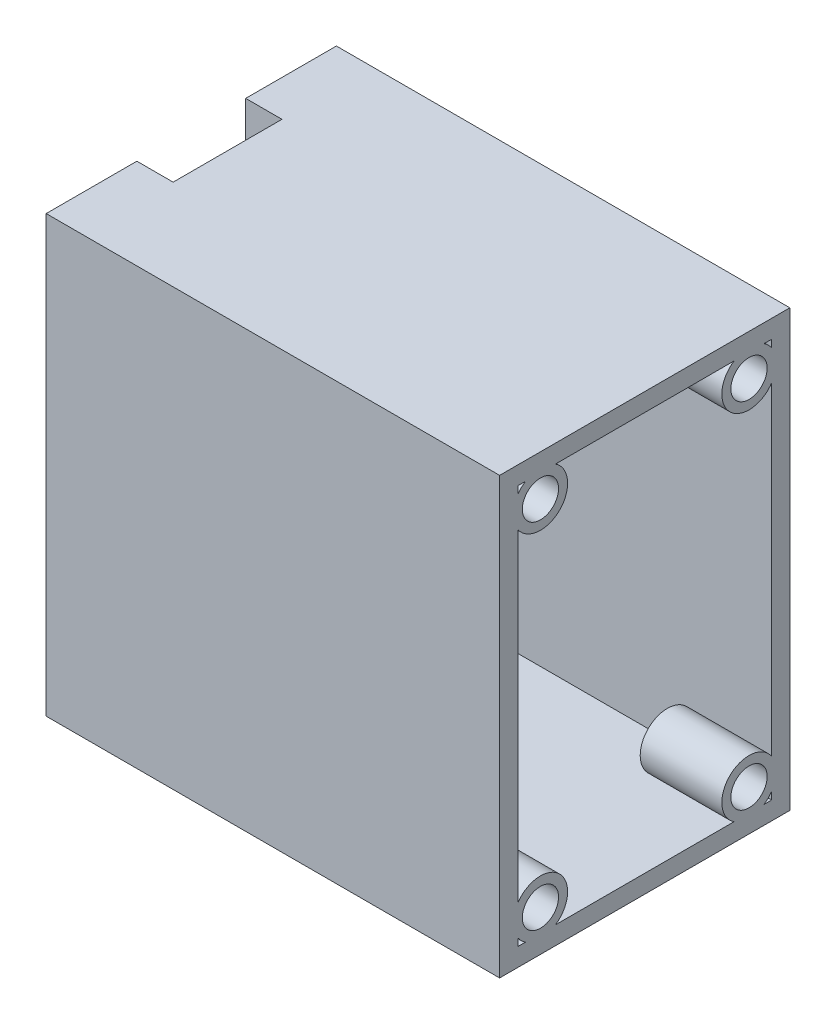
ISO-10303-21;
HEADER;
FILE_DESCRIPTION(('STEP AP214'),'2;1');
FILE_NAME('part.step','',(''),(''),'','','');
FILE_SCHEMA(('AUTOMOTIVE_DESIGN { 1 0 10303 214 1 1 1 1 }'));
ENDSEC;
DATA;
#1=APPLICATION_CONTEXT('core data for automotive mechanical design processes');
#2=APPLICATION_PROTOCOL_DEFINITION('international standard','automotive_design',2000,#1);
#3=PRODUCT_CONTEXT('',#1,'mechanical');
#4=PRODUCT('Part','Part','',(#3));
#5=PRODUCT_RELATED_PRODUCT_CATEGORY('part','',(#4));
#6=PRODUCT_DEFINITION_FORMATION('','',#4);
#7=PRODUCT_DEFINITION_CONTEXT('part definition',#1,'design');
#8=PRODUCT_DEFINITION('design','',#6,#7);
#9=PRODUCT_DEFINITION_SHAPE('','',#8);
#10=(LENGTH_UNIT() NAMED_UNIT(*) SI_UNIT(.MILLI.,.METRE.));
#11=(NAMED_UNIT(*) PLANE_ANGLE_UNIT() SI_UNIT($,.RADIAN.));
#12=(NAMED_UNIT(*) SI_UNIT($,.STERADIAN.) SOLID_ANGLE_UNIT());
#13=UNCERTAINTY_MEASURE_WITH_UNIT(LENGTH_MEASURE(1.E-05),#10,'distance_accuracy_value','');
#14=(GEOMETRIC_REPRESENTATION_CONTEXT(3) GLOBAL_UNCERTAINTY_ASSIGNED_CONTEXT((#13)) GLOBAL_UNIT_ASSIGNED_CONTEXT((#10,
#11,#12)) REPRESENTATION_CONTEXT('',''));
#15=CARTESIAN_POINT('',(0.,0.,0.));
#16=DIRECTION('',(0.,0.,1.));
#17=DIRECTION('',(1.,0.,0.));
#18=AXIS2_PLACEMENT_3D('',#15,#16,#17);
#19=CARTESIAN_POINT('',(-24.,0.,16.));
#20=DIRECTION('',(0.,0.,1.));
#21=DIRECTION('',(1.,0.,0.));
#22=AXIS2_PLACEMENT_3D('',#19,#20,#21);
#23=PLANE('',#22);
#24=DIRECTION('',(0.,-1.,0.));
#25=VECTOR('',#24,1.);
#26=CARTESIAN_POINT('',(25.,-23.,16.));
#27=LINE('',#26,#25);
#28=CARTESIAN_POINT('',(25.,24.,16.));
#29=VERTEX_POINT('',#28);
#30=CARTESIAN_POINT('',(25.,-24.,16.));
#31=VERTEX_POINT('',#30);
#32=EDGE_CURVE('E438',#29,#31,#27,.T.);
#33=ORIENTED_EDGE('',*,*,#32,.F.);
#34=DIRECTION('',(1.,0.,0.));
#35=VECTOR('',#34,1.);
#36=CARTESIAN_POINT('',(-24.,24.,16.));
#37=LINE('',#36,#35);
#38=CARTESIAN_POINT('',(-25.,24.,16.));
#39=VERTEX_POINT('',#38);
#40=EDGE_CURVE('E460',#39,#29,#37,.T.);
#41=ORIENTED_EDGE('',*,*,#40,.F.);
#42=DIRECTION('',(0.,1.,0.));
#43=VECTOR('',#42,1.);
#44=CARTESIAN_POINT('',(-25.,0.,16.));
#45=LINE('',#44,#43);
#46=CARTESIAN_POINT('',(-25.,-24.,16.));
#47=VERTEX_POINT('',#46);
#48=EDGE_CURVE('E457',#47,#39,#45,.T.);
#49=ORIENTED_EDGE('',*,*,#48,.F.);
#50=DIRECTION('',(-1.,0.,0.));
#51=VECTOR('',#50,1.);
#52=CARTESIAN_POINT('',(-24.,-24.,16.));
#53=LINE('',#52,#51);
#54=EDGE_CURVE('E465',#31,#47,#53,.T.);
#55=ORIENTED_EDGE('',*,*,#54,.F.);
#56=EDGE_LOOP('',(#33,#41,#49,#55));
#57=FACE_BOUND('',#56,.T.);
#58=ADVANCED_FACE('F15',(#57),#23,.T.);
#59=CARTESIAN_POINT('',(-24.,-24.,-16.));
#60=DIRECTION('',(0.,-1.,0.));
#61=DIRECTION('',(0.,0.,-1.));
#62=AXIS2_PLACEMENT_3D('',#59,#60,#61);
#63=PLANE('',#62);
#64=DIRECTION('',(-1.,0.,0.));
#65=VECTOR('',#64,1.);
#66=CARTESIAN_POINT('',(-24.,-24.,6.));
#67=LINE('',#66,#65);
#68=CARTESIAN_POINT('',(-21.,-24.,6.));
#69=VERTEX_POINT('',#68);
#70=CARTESIAN_POINT('',(-25.,-24.,6.));
#71=VERTEX_POINT('',#70);
#72=EDGE_CURVE('E299',#69,#71,#67,.T.);
#73=ORIENTED_EDGE('',*,*,#72,.F.);
#74=DIRECTION('',(0.,0.,1.));
#75=VECTOR('',#74,1.);
#76=CARTESIAN_POINT('',(-21.,-24.,-16.));
#77=LINE('',#76,#75);
#78=CARTESIAN_POINT('',(-21.,-24.,-6.));
#79=VERTEX_POINT('',#78);
#80=EDGE_CURVE('E288',#79,#69,#77,.T.);
#81=ORIENTED_EDGE('',*,*,#80,.F.);
#82=DIRECTION('',(1.,0.,0.));
#83=VECTOR('',#82,1.);
#84=CARTESIAN_POINT('',(-24.,-24.,-6.));
#85=LINE('',#84,#83);
#86=CARTESIAN_POINT('',(-25.,-24.,-6.));
#87=VERTEX_POINT('',#86);
#88=EDGE_CURVE('E292',#87,#79,#85,.T.);
#89=ORIENTED_EDGE('',*,*,#88,.F.);
#90=DIRECTION('',(0.,0.,1.));
#91=VECTOR('',#90,1.);
#92=CARTESIAN_POINT('',(-25.,-24.,-16.));
#93=LINE('',#92,#91);
#94=CARTESIAN_POINT('',(-25.,-24.,-16.));
#95=VERTEX_POINT('',#94);
#96=EDGE_CURVE('E453',#95,#87,#93,.T.);
#97=ORIENTED_EDGE('',*,*,#96,.F.);
#98=DIRECTION('',(1.,0.,0.));
#99=VECTOR('',#98,1.);
#100=CARTESIAN_POINT('',(-24.,-24.,-16.));
#101=LINE('',#100,#99);
#102=CARTESIAN_POINT('',(25.,-24.,-16.));
#103=VERTEX_POINT('',#102);
#104=EDGE_CURVE('E444',#95,#103,#101,.T.);
#105=ORIENTED_EDGE('',*,*,#104,.T.);
#106=DIRECTION('',(0.,0.,1.));
#107=VECTOR('',#106,1.);
#108=CARTESIAN_POINT('',(25.,-24.,-16.));
#109=LINE('',#108,#107);
#110=EDGE_CURVE('E435',#103,#31,#109,.T.);
#111=ORIENTED_EDGE('',*,*,#110,.T.);
#112=ORIENTED_EDGE('',*,*,#54,.T.);
#113=EDGE_CURVE('E455',#71,#47,#93,.T.);
#114=ORIENTED_EDGE('',*,*,#113,.F.);
#115=EDGE_LOOP('',(#73,#81,#89,#97,#105,#111,#112,#114));
#116=FACE_BOUND('',#115,.T.);
#117=ADVANCED_FACE('F567',(#116),#63,.T.);
#118=CARTESIAN_POINT('',(-25.,0.,-16.));
#119=DIRECTION('',(-1.,0.,0.));
#120=DIRECTION('',(0.,0.,1.));
#121=AXIS2_PLACEMENT_3D('',#118,#119,#120);
#122=PLANE('',#121);
#123=DIRECTION('',(0.,1.,0.));
#124=VECTOR('',#123,1.);
#125=CARTESIAN_POINT('',(-25.,0.,6.));
#126=LINE('',#125,#124);
#127=CARTESIAN_POINT('',(-25.,16.,6.));
#128=VERTEX_POINT('',#127);
#129=CARTESIAN_POINT('',(-25.,24.,6.));
#130=VERTEX_POINT('',#129);
#131=EDGE_CURVE('E272',#128,#130,#126,.T.);
#132=ORIENTED_EDGE('',*,*,#131,.F.);
#133=DIRECTION('',(0.,0.,1.));
#134=VECTOR('',#133,1.);
#135=CARTESIAN_POINT('',(-25.,16.,-16.));
#136=LINE('',#135,#134);
#137=CARTESIAN_POINT('',(-25.,16.,-6.));
#138=VERTEX_POINT('',#137);
#139=EDGE_CURVE('E274',#138,#128,#136,.T.);
#140=ORIENTED_EDGE('',*,*,#139,.F.);
#141=DIRECTION('',(0.,-1.,0.));
#142=VECTOR('',#141,1.);
#143=CARTESIAN_POINT('',(-25.,0.,-6.));
#144=LINE('',#143,#142);
#145=CARTESIAN_POINT('',(-25.,24.,-6.));
#146=VERTEX_POINT('',#145);
#147=EDGE_CURVE('E262',#146,#138,#144,.T.);
#148=ORIENTED_EDGE('',*,*,#147,.F.);
#149=DIRECTION('',(0.,0.,1.));
#150=VECTOR('',#149,1.);
#151=CARTESIAN_POINT('',(-25.,24.,-16.));
#152=LINE('',#151,#150);
#153=CARTESIAN_POINT('',(-25.,24.,-16.));
#154=VERTEX_POINT('',#153);
#155=EDGE_CURVE('E263',#154,#146,#152,.T.);
#156=ORIENTED_EDGE('',*,*,#155,.F.);
#157=DIRECTION('',(0.,-1.,0.));
#158=VECTOR('',#157,1.);
#159=CARTESIAN_POINT('',(-25.,0.,-16.));
#160=LINE('',#159,#158);
#161=EDGE_CURVE('E443',#154,#95,#160,.T.);
#162=ORIENTED_EDGE('',*,*,#161,.T.);
#163=ORIENTED_EDGE('',*,*,#96,.T.);
#164=DIRECTION('',(0.,-1.,0.));
#165=VECTOR('',#164,1.);
#166=CARTESIAN_POINT('',(-25.,0.,-6.));
#167=LINE('',#166,#165);
#168=CARTESIAN_POINT('',(-25.,-16.,-6.));
#169=VERTEX_POINT('',#168);
#170=EDGE_CURVE('E291',#169,#87,#167,.T.);
#171=ORIENTED_EDGE('',*,*,#170,.F.);
#172=DIRECTION('',(0.,0.,-1.));
#173=VECTOR('',#172,1.);
#174=CARTESIAN_POINT('',(-25.,-16.,-16.));
#175=LINE('',#174,#173);
#176=CARTESIAN_POINT('',(-25.,-16.,6.));
#177=VERTEX_POINT('',#176);
#178=EDGE_CURVE('E305',#177,#169,#175,.T.);
#179=ORIENTED_EDGE('',*,*,#178,.F.);
#180=DIRECTION('',(0.,1.,0.));
#181=VECTOR('',#180,1.);
#182=CARTESIAN_POINT('',(-25.,0.,6.));
#183=LINE('',#182,#181);
#184=EDGE_CURVE('E297',#71,#177,#183,.T.);
#185=ORIENTED_EDGE('',*,*,#184,.F.);
#186=ORIENTED_EDGE('',*,*,#113,.T.);
#187=ORIENTED_EDGE('',*,*,#48,.T.);
#188=EDGE_CURVE('E449',#130,#39,#152,.T.);
#189=ORIENTED_EDGE('',*,*,#188,.F.);
#190=EDGE_LOOP('',(#132,#140,#148,#156,#162,#163,#171,#179,#185,#186,#187,#189));
#191=FACE_BOUND('',#190,.T.);
#192=ADVANCED_FACE('F561',(#191),#122,.T.);
#193=CARTESIAN_POINT('',(-24.,24.,-16.));
#194=DIRECTION('',(0.,1.,0.));
#195=DIRECTION('',(0.,0.,1.));
#196=AXIS2_PLACEMENT_3D('',#193,#194,#195);
#197=PLANE('',#196);
#198=DIRECTION('',(1.,0.,0.));
#199=VECTOR('',#198,1.);
#200=CARTESIAN_POINT('',(-24.,24.,6.));
#201=LINE('',#200,#199);
#202=CARTESIAN_POINT('',(-21.,24.,6.));
#203=VERTEX_POINT('',#202);
#204=EDGE_CURVE('E271',#130,#203,#201,.T.);
#205=ORIENTED_EDGE('',*,*,#204,.F.);
#206=ORIENTED_EDGE('',*,*,#188,.T.);
#207=ORIENTED_EDGE('',*,*,#40,.T.);
#208=DIRECTION('',(0.,0.,1.));
#209=VECTOR('',#208,1.);
#210=CARTESIAN_POINT('',(25.,24.,-16.));
#211=LINE('',#210,#209);
#212=CARTESIAN_POINT('',(25.,24.,-16.));
#213=VERTEX_POINT('',#212);
#214=EDGE_CURVE('E426',#213,#29,#211,.T.);
#215=ORIENTED_EDGE('',*,*,#214,.F.);
#216=DIRECTION('',(-1.,0.,0.));
#217=VECTOR('',#216,1.);
#218=CARTESIAN_POINT('',(-24.,24.,-16.));
#219=LINE('',#218,#217);
#220=EDGE_CURVE('E446',#213,#154,#219,.T.);
#221=ORIENTED_EDGE('',*,*,#220,.T.);
#222=ORIENTED_EDGE('',*,*,#155,.T.);
#223=DIRECTION('',(-1.,0.,0.));
#224=VECTOR('',#223,1.);
#225=CARTESIAN_POINT('',(-24.,24.,-6.));
#226=LINE('',#225,#224);
#227=CARTESIAN_POINT('',(-21.,24.,-6.));
#228=VERTEX_POINT('',#227);
#229=EDGE_CURVE('E251',#228,#146,#226,.T.);
#230=ORIENTED_EDGE('',*,*,#229,.F.);
#231=DIRECTION('',(0.,0.,-1.));
#232=VECTOR('',#231,1.);
#233=CARTESIAN_POINT('',(-21.,24.,-16.));
#234=LINE('',#233,#232);
#235=EDGE_CURVE('E242',#203,#228,#234,.T.);
#236=ORIENTED_EDGE('',*,*,#235,.F.);
#237=EDGE_LOOP('',(#205,#206,#207,#215,#221,#222,#230,#236));
#238=FACE_BOUND('',#237,.T.);
#239=ADVANCED_FACE('F261',(#238),#197,.T.);
#240=CARTESIAN_POINT('',(-24.,0.,-16.));
#241=DIRECTION('',(0.,0.,-1.));
#242=DIRECTION('',(-1.,0.,0.));
#243=AXIS2_PLACEMENT_3D('',#240,#241,#242);
#244=PLANE('',#243);
#245=ORIENTED_EDGE('',*,*,#220,.F.);
#246=DIRECTION('',(0.,1.,0.));
#247=VECTOR('',#246,1.);
#248=CARTESIAN_POINT('',(25.,-23.,-16.));
#249=LINE('',#248,#247);
#250=EDGE_CURVE('E429',#103,#213,#249,.T.);
#251=ORIENTED_EDGE('',*,*,#250,.F.);
#252=ORIENTED_EDGE('',*,*,#104,.F.);
#253=ORIENTED_EDGE('',*,*,#161,.F.);
#254=EDGE_LOOP('',(#245,#251,#252,#253));
#255=FACE_BOUND('',#254,.T.);
#256=ADVANCED_FACE('F602',(#255),#244,.T.);
#257=CARTESIAN_POINT('',(-23.,0.,-16.));
#258=DIRECTION('',(1.,0.,0.));
#259=DIRECTION('',(0.,0.,-1.));
#260=AXIS2_PLACEMENT_3D('',#257,#258,#259);
#261=PLANE('',#260);
#262=DIRECTION('',(0.,-1.,0.));
#263=VECTOR('',#262,1.);
#264=CARTESIAN_POINT('',(-23.,0.,6.));
#265=LINE('',#264,#263);
#266=CARTESIAN_POINT('',(-23.,22.,6.));
#267=VERTEX_POINT('',#266);
#268=CARTESIAN_POINT('',(-23.,16.,6.));
#269=VERTEX_POINT('',#268);
#270=EDGE_CURVE('E266',#267,#269,#265,.T.);
#271=ORIENTED_EDGE('',*,*,#270,.F.);
#272=DIRECTION('',(0.,0.,-1.));
#273=VECTOR('',#272,1.);
#274=CARTESIAN_POINT('',(-23.,22.,-16.));
#275=LINE('',#274,#273);
#276=CARTESIAN_POINT('',(-23.,22.,14.));
#277=VERTEX_POINT('',#276);
#278=EDGE_CURVE('E469',#277,#267,#275,.T.);
#279=ORIENTED_EDGE('',*,*,#278,.F.);
#280=DIRECTION('',(0.,1.,0.));
#281=VECTOR('',#280,1.);
#282=CARTESIAN_POINT('',(-23.,0.,14.));
#283=LINE('',#282,#281);
#284=CARTESIAN_POINT('',(-23.,-22.,14.));
#285=VERTEX_POINT('',#284);
#286=EDGE_CURVE('E402',#285,#277,#283,.T.);
#287=ORIENTED_EDGE('',*,*,#286,.F.);
#288=DIRECTION('',(0.,0.,1.));
#289=VECTOR('',#288,1.);
#290=CARTESIAN_POINT('',(-23.,-22.,-16.));
#291=LINE('',#290,#289);
#292=CARTESIAN_POINT('',(-23.,-22.,6.));
#293=VERTEX_POINT('',#292);
#294=EDGE_CURVE('E464',#293,#285,#291,.T.);
#295=ORIENTED_EDGE('',*,*,#294,.F.);
#296=DIRECTION('',(0.,-1.,0.));
#297=VECTOR('',#296,1.);
#298=CARTESIAN_POINT('',(-23.,0.,6.));
#299=LINE('',#298,#297);
#300=CARTESIAN_POINT('',(-23.,-16.,6.));
#301=VERTEX_POINT('',#300);
#302=EDGE_CURVE('E296',#301,#293,#299,.T.);
#303=ORIENTED_EDGE('',*,*,#302,.F.);
#304=DIRECTION('',(0.,0.,1.));
#305=VECTOR('',#304,1.);
#306=CARTESIAN_POINT('',(-23.,-16.,-16.));
#307=LINE('',#306,#305);
#308=CARTESIAN_POINT('',(-23.,-16.,-6.));
#309=VERTEX_POINT('',#308);
#310=EDGE_CURVE('E516',#309,#301,#307,.T.);
#311=ORIENTED_EDGE('',*,*,#310,.F.);
#312=DIRECTION('',(0.,1.,0.));
#313=VECTOR('',#312,1.);
#314=CARTESIAN_POINT('',(-23.,0.,-6.));
#315=LINE('',#314,#313);
#316=CARTESIAN_POINT('',(-23.,-22.,-6.));
#317=VERTEX_POINT('',#316);
#318=EDGE_CURVE('E289',#317,#309,#315,.T.);
#319=ORIENTED_EDGE('',*,*,#318,.F.);
#320=CARTESIAN_POINT('',(-23.,-22.,-14.));
#321=VERTEX_POINT('',#320);
#322=EDGE_CURVE('E466',#321,#317,#291,.T.);
#323=ORIENTED_EDGE('',*,*,#322,.F.);
#324=DIRECTION('',(0.,-1.,0.));
#325=VECTOR('',#324,1.);
#326=CARTESIAN_POINT('',(-23.,0.,-14.));
#327=LINE('',#326,#325);
#328=CARTESIAN_POINT('',(-23.,22.,-14.));
#329=VERTEX_POINT('',#328);
#330=EDGE_CURVE('E419',#329,#321,#327,.T.);
#331=ORIENTED_EDGE('',*,*,#330,.F.);
#332=CARTESIAN_POINT('',(-23.,22.,-6.));
#333=VERTEX_POINT('',#332);
#334=EDGE_CURVE('E467',#333,#329,#275,.T.);
#335=ORIENTED_EDGE('',*,*,#334,.F.);
#336=DIRECTION('',(0.,1.,0.));
#337=VECTOR('',#336,1.);
#338=CARTESIAN_POINT('',(-23.,0.,-6.));
#339=LINE('',#338,#337);
#340=CARTESIAN_POINT('',(-23.,16.,-6.));
#341=VERTEX_POINT('',#340);
#342=EDGE_CURVE('E248',#341,#333,#339,.T.);
#343=ORIENTED_EDGE('',*,*,#342,.F.);
#344=DIRECTION('',(0.,0.,-1.));
#345=VECTOR('',#344,1.);
#346=CARTESIAN_POINT('',(-23.,16.,-16.));
#347=LINE('',#346,#345);
#348=EDGE_CURVE('E10',#269,#341,#347,.T.);
#349=ORIENTED_EDGE('',*,*,#348,.F.);
#350=EDGE_LOOP('',(#271,#279,#287,#295,#303,#311,#319,#323,#331,#335,#343,#349));
#351=FACE_BOUND('',#350,.T.);
#352=ADVANCED_FACE('F529',(#351),#261,.T.);
#353=CARTESIAN_POINT('',(0.75,-22.,-16.));
#354=DIRECTION('',(0.,1.,0.));
#355=DIRECTION('',(0.,0.,1.));
#356=AXIS2_PLACEMENT_3D('',#353,#354,#355);
#357=PLANE('',#356);
#358=DIRECTION('',(1.,0.,0.));
#359=VECTOR('',#358,1.);
#360=CARTESIAN_POINT('',(0.75,-22.,6.));
#361=LINE('',#360,#359);
#362=CARTESIAN_POINT('',(-21.,-22.,6.));
#363=VERTEX_POINT('',#362);
#364=EDGE_CURVE('E513',#293,#363,#361,.T.);
#365=ORIENTED_EDGE('',*,*,#364,.F.);
#366=ORIENTED_EDGE('',*,*,#294,.T.);
#367=DIRECTION('',(1.,0.,0.));
#368=VECTOR('',#367,1.);
#369=CARTESIAN_POINT('',(0.75,-22.,14.));
#370=LINE('',#369,#368);
#371=CARTESIAN_POINT('',(25.,-22.,14.));
#372=VERTEX_POINT('',#371);
#373=EDGE_CURVE('E400',#285,#372,#370,.T.);
#374=ORIENTED_EDGE('',*,*,#373,.T.);
#375=DIRECTION('',(0.,0.,1.));
#376=VECTOR('',#375,1.);
#377=CARTESIAN_POINT('',(25.,-22.,-16.));
#378=LINE('',#377,#376);
#379=CARTESIAN_POINT('',(25.,-22.,13.1583123951777));
#380=VERTEX_POINT('',#379);
#381=EDGE_CURVE('E434',#380,#372,#378,.T.);
#382=ORIENTED_EDGE('',*,*,#381,.F.);
#383=DIRECTION('',(1.,0.,0.));
#384=VECTOR('',#383,1.);
#385=CARTESIAN_POINT('',(16.,-22.,13.1583123951777));
#386=LINE('',#385,#384);
#387=CARTESIAN_POINT('',(16.,-22.,13.1583123951777));
#388=VERTEX_POINT('',#387);
#389=EDGE_CURVE('E366',#388,#380,#386,.T.);
#390=ORIENTED_EDGE('',*,*,#389,.F.);
#391=DIRECTION('',(0.,0.,1.));
#392=VECTOR('',#391,1.);
#393=CARTESIAN_POINT('',(16.,-22.,-16.));
#394=LINE('',#393,#392);
#395=CARTESIAN_POINT('',(16.,-22.,9.8416876048223));
#396=VERTEX_POINT('',#395);
#397=EDGE_CURVE('E371',#396,#388,#394,.T.);
#398=ORIENTED_EDGE('',*,*,#397,.F.);
#399=DIRECTION('',(1.,0.,0.));
#400=VECTOR('',#399,1.);
#401=CARTESIAN_POINT('',(16.,-22.,9.8416876048223));
#402=LINE('',#401,#400);
#403=CARTESIAN_POINT('',(25.,-22.,9.8416876048223));
#404=VERTEX_POINT('',#403);
#405=EDGE_CURVE('E362',#404,#396,#402,.F.);
#406=ORIENTED_EDGE('',*,*,#405,.F.);
#407=CARTESIAN_POINT('',(25.,-22.,-9.8416876048223));
#408=VERTEX_POINT('',#407);
#409=EDGE_CURVE('E439',#408,#404,#378,.T.);
#410=ORIENTED_EDGE('',*,*,#409,.F.);
#411=DIRECTION('',(1.,0.,0.));
#412=VECTOR('',#411,1.);
#413=CARTESIAN_POINT('',(16.,-22.,-9.8416876048223));
#414=LINE('',#413,#412);
#415=CARTESIAN_POINT('',(16.,-22.,-9.8416876048223));
#416=VERTEX_POINT('',#415);
#417=EDGE_CURVE('E391',#416,#408,#414,.T.);
#418=ORIENTED_EDGE('',*,*,#417,.F.);
#419=DIRECTION('',(0.,0.,1.));
#420=VECTOR('',#419,1.);
#421=CARTESIAN_POINT('',(16.,-22.,-16.));
#422=LINE('',#421,#420);
#423=CARTESIAN_POINT('',(16.,-22.,-13.1583123951777));
#424=VERTEX_POINT('',#423);
#425=EDGE_CURVE('E393',#424,#416,#422,.T.);
#426=ORIENTED_EDGE('',*,*,#425,.F.);
#427=DIRECTION('',(1.,0.,0.));
#428=VECTOR('',#427,1.);
#429=CARTESIAN_POINT('',(16.,-22.,-13.1583123951777));
#430=LINE('',#429,#428);
#431=CARTESIAN_POINT('',(25.,-22.,-13.1583123951777));
#432=VERTEX_POINT('',#431);
#433=EDGE_CURVE('E389',#432,#424,#430,.F.);
#434=ORIENTED_EDGE('',*,*,#433,.F.);
#435=CARTESIAN_POINT('',(25.,-22.,-14.));
#436=VERTEX_POINT('',#435);
#437=EDGE_CURVE('E436',#436,#432,#378,.T.);
#438=ORIENTED_EDGE('',*,*,#437,.F.);
#439=DIRECTION('',(-1.,0.,0.));
#440=VECTOR('',#439,1.);
#441=CARTESIAN_POINT('',(0.75,-22.,-14.));
#442=LINE('',#441,#440);
#443=EDGE_CURVE('E416',#436,#321,#442,.T.);
#444=ORIENTED_EDGE('',*,*,#443,.T.);
#445=ORIENTED_EDGE('',*,*,#322,.T.);
#446=DIRECTION('',(-1.,0.,0.));
#447=VECTOR('',#446,1.);
#448=CARTESIAN_POINT('',(0.75,-22.,-6.));
#449=LINE('',#448,#447);
#450=CARTESIAN_POINT('',(-21.,-22.,-6.));
#451=VERTEX_POINT('',#450);
#452=EDGE_CURVE('E515',#451,#317,#449,.T.);
#453=ORIENTED_EDGE('',*,*,#452,.F.);
#454=DIRECTION('',(0.,0.,-1.));
#455=VECTOR('',#454,1.);
#456=CARTESIAN_POINT('',(-21.,-22.,-16.));
#457=LINE('',#456,#455);
#458=EDGE_CURVE('E507',#363,#451,#457,.T.);
#459=ORIENTED_EDGE('',*,*,#458,.F.);
#460=EDGE_LOOP('',(#365,#366,#374,#382,#390,#398,#406,#410,#418,#426,#434,#438,#444,#445,#453,#459));
#461=FACE_BOUND('',#460,.T.);
#462=ADVANCED_FACE('F546',(#461),#357,.T.);
#463=CARTESIAN_POINT('',(25.,-23.,-16.));
#464=DIRECTION('',(1.,0.,0.));
#465=DIRECTION('',(0.,0.,-1.));
#466=AXIS2_PLACEMENT_3D('',#463,#464,#465);
#467=PLANE('',#466);
#468=DIRECTION('',(0.,0.,1.));
#469=VECTOR('',#468,1.);
#470=CARTESIAN_POINT('',(25.,22.,-16.));
#471=LINE('',#470,#469);
#472=CARTESIAN_POINT('',(25.,22.,13.1583123951777));
#473=VERTEX_POINT('',#472);
#474=CARTESIAN_POINT('',(25.,22.,14.));
#475=VERTEX_POINT('',#474);
#476=EDGE_CURVE('E421',#473,#475,#471,.T.);
#477=ORIENTED_EDGE('',*,*,#476,.F.);
#478=CARTESIAN_POINT('',(25.,19.5,11.5));
#479=DIRECTION('',(-1.,0.,0.));
#480=DIRECTION('',(0.,0.,1.));
#481=AXIS2_PLACEMENT_3D('',#478,#479,#480);
#482=CIRCLE('',#481,3.);
#483=CARTESIAN_POINT('',(25.,21.1583123951777,14.));
#484=VERTEX_POINT('',#483);
#485=EDGE_CURVE('E311',#484,#473,#482,.T.);
#486=ORIENTED_EDGE('',*,*,#485,.F.);
#487=DIRECTION('',(0.,1.,0.));
#488=VECTOR('',#487,1.);
#489=CARTESIAN_POINT('',(25.,0.,14.));
#490=LINE('',#489,#488);
#491=EDGE_CURVE('E406',#484,#475,#490,.T.);
#492=ORIENTED_EDGE('',*,*,#491,.T.);
#493=EDGE_LOOP('',(#477,#486,#492));
#494=FACE_BOUND('',#493,.T.);
#495=CARTESIAN_POINT('',(25.,22.,9.8416876048223));
#496=VERTEX_POINT('',#495);
#497=CARTESIAN_POINT('',(25.,17.8416876048223,14.));
#498=VERTEX_POINT('',#497);
#499=EDGE_CURVE('E320',#496,#498,#482,.T.);
#500=ORIENTED_EDGE('',*,*,#499,.F.);
#501=CARTESIAN_POINT('',(25.,22.,-9.8416876048223));
#502=VERTEX_POINT('',#501);
#503=EDGE_CURVE('E430',#502,#496,#471,.T.);
#504=ORIENTED_EDGE('',*,*,#503,.F.);
#505=CARTESIAN_POINT('',(25.,19.5,-11.5));
#506=DIRECTION('',(-1.,0.,0.));
#507=DIRECTION('',(0.,0.,1.));
#508=AXIS2_PLACEMENT_3D('',#505,#506,#507);
#509=CIRCLE('',#508,3.);
#510=CARTESIAN_POINT('',(25.,17.8416876048223,-14.));
#511=VERTEX_POINT('',#510);
#512=EDGE_CURVE('E336',#511,#502,#509,.T.);
#513=ORIENTED_EDGE('',*,*,#512,.F.);
#514=DIRECTION('',(0.,-1.,0.));
#515=VECTOR('',#514,1.);
#516=CARTESIAN_POINT('',(25.,0.,-14.));
#517=LINE('',#516,#515);
#518=CARTESIAN_POINT('',(25.,-17.8416876048223,-14.));
#519=VERTEX_POINT('',#518);
#520=EDGE_CURVE('E414',#511,#519,#517,.T.);
#521=ORIENTED_EDGE('',*,*,#520,.T.);
#522=CARTESIAN_POINT('',(25.,-19.5,-11.5));
#523=DIRECTION('',(-1.,0.,0.));
#524=DIRECTION('',(0.,0.,1.));
#525=AXIS2_PLACEMENT_3D('',#522,#523,#524);
#526=CIRCLE('',#525,3.);
#527=EDGE_CURVE('E385',#408,#519,#526,.T.);
#528=ORIENTED_EDGE('',*,*,#527,.F.);
#529=ORIENTED_EDGE('',*,*,#409,.T.);
#530=CARTESIAN_POINT('',(25.,-19.5,11.5));
#531=DIRECTION('',(-1.,0.,0.));
#532=DIRECTION('',(0.,0.,1.));
#533=AXIS2_PLACEMENT_3D('',#530,#531,#532);
#534=CIRCLE('',#533,3.);
#535=CARTESIAN_POINT('',(25.,-17.8416876048223,14.));
#536=VERTEX_POINT('',#535);
#537=EDGE_CURVE('E357',#536,#404,#534,.T.);
#538=ORIENTED_EDGE('',*,*,#537,.F.);
#539=EDGE_CURVE('E404',#536,#498,#490,.T.);
#540=ORIENTED_EDGE('',*,*,#539,.T.);
#541=EDGE_LOOP('',(#500,#504,#513,#521,#528,#529,#538,#540));
#542=FACE_BOUND('',#541,.T.);
#543=CARTESIAN_POINT('',(25.,22.,-13.1583123951777));
#544=VERTEX_POINT('',#543);
#545=CARTESIAN_POINT('',(25.,21.1583123951777,-14.));
#546=VERTEX_POINT('',#545);
#547=EDGE_CURVE('E338',#544,#546,#509,.T.);
#548=ORIENTED_EDGE('',*,*,#547,.F.);
#549=CARTESIAN_POINT('',(25.,22.,-14.));
#550=VERTEX_POINT('',#549);
#551=EDGE_CURVE('E424',#550,#544,#471,.T.);
#552=ORIENTED_EDGE('',*,*,#551,.F.);
#553=EDGE_CURVE('E411',#550,#546,#517,.T.);
#554=ORIENTED_EDGE('',*,*,#553,.T.);
#555=EDGE_LOOP('',(#548,#552,#554));
#556=FACE_BOUND('',#555,.T.);
#557=CARTESIAN_POINT('',(25.,-21.1583123951777,14.));
#558=VERTEX_POINT('',#557);
#559=EDGE_CURVE('E405',#372,#558,#490,.T.);
#560=ORIENTED_EDGE('',*,*,#559,.T.);
#561=EDGE_CURVE('E361',#380,#558,#534,.T.);
#562=ORIENTED_EDGE('',*,*,#561,.F.);
#563=ORIENTED_EDGE('',*,*,#381,.T.);
#564=EDGE_LOOP('',(#560,#562,#563));
#565=FACE_BOUND('',#564,.T.);
#566=ORIENTED_EDGE('',*,*,#437,.T.);
#567=CARTESIAN_POINT('',(25.,-21.1583123951777,-14.));
#568=VERTEX_POINT('',#567);
#569=EDGE_CURVE('E384',#568,#432,#526,.T.);
#570=ORIENTED_EDGE('',*,*,#569,.F.);
#571=EDGE_CURVE('E409',#568,#436,#517,.T.);
#572=ORIENTED_EDGE('',*,*,#571,.T.);
#573=EDGE_LOOP('',(#566,#570,#572));
#574=FACE_BOUND('',#573,.T.);
#575=ORIENTED_EDGE('',*,*,#214,.T.);
#576=ORIENTED_EDGE('',*,*,#32,.T.);
#577=ORIENTED_EDGE('',*,*,#110,.F.);
#578=ORIENTED_EDGE('',*,*,#250,.T.);
#579=EDGE_LOOP('',(#575,#576,#577,#578));
#580=FACE_BOUND('',#579,.T.);
#581=CARTESIAN_POINT('',(25.,-19.5,-11.5));
#582=DIRECTION('',(1.,0.,0.));
#583=DIRECTION('',(0.,0.,-1.));
#584=AXIS2_PLACEMENT_3D('',#581,#582,#583);
#585=CIRCLE('',#584,2.);
#586=CARTESIAN_POINT('',(25.,-19.5,-13.5));
#587=VERTEX_POINT('',#586);
#588=EDGE_CURVE('E374',#587,#587,#585,.T.);
#589=ORIENTED_EDGE('',*,*,#588,.F.);
#590=EDGE_LOOP('',(#589));
#591=FACE_BOUND('',#590,.T.);
#592=CARTESIAN_POINT('',(25.,-19.5,11.5));
#593=DIRECTION('',(1.,0.,0.));
#594=DIRECTION('',(0.,0.,-1.));
#595=AXIS2_PLACEMENT_3D('',#592,#593,#594);
#596=CIRCLE('',#595,2.);
#597=CARTESIAN_POINT('',(25.,-19.5,9.5));
#598=VERTEX_POINT('',#597);
#599=EDGE_CURVE('E355',#598,#598,#596,.T.);
#600=ORIENTED_EDGE('',*,*,#599,.F.);
#601=EDGE_LOOP('',(#600));
#602=FACE_BOUND('',#601,.T.);
#603=CARTESIAN_POINT('',(25.,19.5,-11.5));
#604=DIRECTION('',(1.,0.,0.));
#605=DIRECTION('',(0.,0.,-1.));
#606=AXIS2_PLACEMENT_3D('',#603,#604,#605);
#607=CIRCLE('',#606,2.);
#608=CARTESIAN_POINT('',(25.,19.5,-13.5));
#609=VERTEX_POINT('',#608);
#610=EDGE_CURVE('E328',#609,#609,#607,.T.);
#611=ORIENTED_EDGE('',*,*,#610,.F.);
#612=EDGE_LOOP('',(#611));
#613=FACE_BOUND('',#612,.T.);
#614=CARTESIAN_POINT('',(25.,19.5,11.5));
#615=DIRECTION('',(1.,0.,0.));
#616=DIRECTION('',(0.,0.,-1.));
#617=AXIS2_PLACEMENT_3D('',#614,#615,#616);
#618=CIRCLE('',#617,2.);
#619=CARTESIAN_POINT('',(25.,19.5,9.5));
#620=VERTEX_POINT('',#619);
#621=EDGE_CURVE('E308',#620,#620,#618,.T.);
#622=ORIENTED_EDGE('',*,*,#621,.F.);
#623=EDGE_LOOP('',(#622));
#624=FACE_BOUND('',#623,.T.);
#625=ADVANCED_FACE('F594',(#494,#542,#556,#565,#574,#580,#591,#602,#613,#624),#467,.T.);
#626=CARTESIAN_POINT('',(0.75,22.,-16.));
#627=DIRECTION('',(0.,-1.,0.));
#628=DIRECTION('',(0.,0.,-1.));
#629=AXIS2_PLACEMENT_3D('',#626,#627,#628);
#630=PLANE('',#629);
#631=DIRECTION('',(-1.,0.,0.));
#632=VECTOR('',#631,1.);
#633=CARTESIAN_POINT('',(0.75,22.,6.));
#634=LINE('',#633,#632);
#635=CARTESIAN_POINT('',(-21.,22.,6.));
#636=VERTEX_POINT('',#635);
#637=EDGE_CURVE('E22',#636,#267,#634,.T.);
#638=ORIENTED_EDGE('',*,*,#637,.F.);
#639=DIRECTION('',(0.,0.,1.));
#640=VECTOR('',#639,1.);
#641=CARTESIAN_POINT('',(-21.,22.,-16.));
#642=LINE('',#641,#640);
#643=CARTESIAN_POINT('',(-21.,22.,-6.));
#644=VERTEX_POINT('',#643);
#645=EDGE_CURVE('E517',#644,#636,#642,.T.);
#646=ORIENTED_EDGE('',*,*,#645,.F.);
#647=DIRECTION('',(1.,0.,0.));
#648=VECTOR('',#647,1.);
#649=CARTESIAN_POINT('',(0.75,22.,-6.));
#650=LINE('',#649,#648);
#651=EDGE_CURVE('E258',#333,#644,#650,.T.);
#652=ORIENTED_EDGE('',*,*,#651,.F.);
#653=ORIENTED_EDGE('',*,*,#334,.T.);
#654=DIRECTION('',(1.,0.,0.));
#655=VECTOR('',#654,1.);
#656=CARTESIAN_POINT('',(0.75,22.,-14.));
#657=LINE('',#656,#655);
#658=EDGE_CURVE('E412',#329,#550,#657,.T.);
#659=ORIENTED_EDGE('',*,*,#658,.T.);
#660=ORIENTED_EDGE('',*,*,#551,.T.);
#661=DIRECTION('',(1.,0.,0.));
#662=VECTOR('',#661,1.);
#663=CARTESIAN_POINT('',(16.,22.,-13.1583123951777));
#664=LINE('',#663,#662);
#665=CARTESIAN_POINT('',(16.,22.,-13.1583123951777));
#666=VERTEX_POINT('',#665);
#667=EDGE_CURVE('E344',#666,#544,#664,.T.);
#668=ORIENTED_EDGE('',*,*,#667,.F.);
#669=DIRECTION('',(0.,0.,-1.));
#670=VECTOR('',#669,1.);
#671=CARTESIAN_POINT('',(16.,22.,-16.));
#672=LINE('',#671,#670);
#673=CARTESIAN_POINT('',(16.,22.,-9.8416876048223));
#674=VERTEX_POINT('',#673);
#675=EDGE_CURVE('E348',#674,#666,#672,.T.);
#676=ORIENTED_EDGE('',*,*,#675,.F.);
#677=DIRECTION('',(1.,0.,0.));
#678=VECTOR('',#677,1.);
#679=CARTESIAN_POINT('',(16.,22.,-9.8416876048223));
#680=LINE('',#679,#678);
#681=EDGE_CURVE('E345',#502,#674,#680,.F.);
#682=ORIENTED_EDGE('',*,*,#681,.F.);
#683=ORIENTED_EDGE('',*,*,#503,.T.);
#684=DIRECTION('',(1.,0.,0.));
#685=VECTOR('',#684,1.);
#686=CARTESIAN_POINT('',(16.,22.,9.8416876048223));
#687=LINE('',#686,#685);
#688=CARTESIAN_POINT('',(16.,22.,9.8416876048223));
#689=VERTEX_POINT('',#688);
#690=EDGE_CURVE('E325',#689,#496,#687,.T.);
#691=ORIENTED_EDGE('',*,*,#690,.F.);
#692=DIRECTION('',(0.,0.,-1.));
#693=VECTOR('',#692,1.);
#694=CARTESIAN_POINT('',(16.,22.,-16.));
#695=LINE('',#694,#693);
#696=CARTESIAN_POINT('',(16.,22.,13.1583123951777));
#697=VERTEX_POINT('',#696);
#698=EDGE_CURVE('E324',#697,#689,#695,.T.);
#699=ORIENTED_EDGE('',*,*,#698,.F.);
#700=DIRECTION('',(1.,0.,0.));
#701=VECTOR('',#700,1.);
#702=CARTESIAN_POINT('',(16.,22.,13.1583123951777));
#703=LINE('',#702,#701);
#704=EDGE_CURVE('E316',#473,#697,#703,.F.);
#705=ORIENTED_EDGE('',*,*,#704,.F.);
#706=ORIENTED_EDGE('',*,*,#476,.T.);
#707=DIRECTION('',(-1.,0.,0.));
#708=VECTOR('',#707,1.);
#709=CARTESIAN_POINT('',(0.75,22.,14.));
#710=LINE('',#709,#708);
#711=EDGE_CURVE('E399',#475,#277,#710,.T.);
#712=ORIENTED_EDGE('',*,*,#711,.T.);
#713=ORIENTED_EDGE('',*,*,#278,.T.);
#714=EDGE_LOOP('',(#638,#646,#652,#653,#659,#660,#668,#676,#682,#683,#691,#699,#705,#706,#712,#713));
#715=FACE_BOUND('',#714,.T.);
#716=ADVANCED_FACE('F531',(#715),#630,.T.);
#717=CARTESIAN_POINT('',(0.75,0.,-14.));
#718=DIRECTION('',(0.,0.,1.));
#719=DIRECTION('',(1.,0.,0.));
#720=AXIS2_PLACEMENT_3D('',#717,#718,#719);
#721=PLANE('',#720);
#722=DIRECTION('',(1.,0.,0.));
#723=VECTOR('',#722,1.);
#724=CARTESIAN_POINT('',(16.,17.8416876048223,-14.));
#725=LINE('',#724,#723);
#726=CARTESIAN_POINT('',(16.,17.8416876048223,-14.));
#727=VERTEX_POINT('',#726);
#728=EDGE_CURVE('E500',#727,#511,#725,.T.);
#729=ORIENTED_EDGE('',*,*,#728,.F.);
#730=DIRECTION('',(0.,-1.,0.));
#731=VECTOR('',#730,1.);
#732=CARTESIAN_POINT('',(16.,0.,-14.));
#733=LINE('',#732,#731);
#734=CARTESIAN_POINT('',(16.,21.1583123951777,-14.));
#735=VERTEX_POINT('',#734);
#736=EDGE_CURVE('E493',#735,#727,#733,.T.);
#737=ORIENTED_EDGE('',*,*,#736,.F.);
#738=DIRECTION('',(1.,0.,0.));
#739=VECTOR('',#738,1.);
#740=CARTESIAN_POINT('',(16.,21.1583123951777,-14.));
#741=LINE('',#740,#739);
#742=EDGE_CURVE('E491',#546,#735,#741,.F.);
#743=ORIENTED_EDGE('',*,*,#742,.F.);
#744=ORIENTED_EDGE('',*,*,#553,.F.);
#745=ORIENTED_EDGE('',*,*,#658,.F.);
#746=ORIENTED_EDGE('',*,*,#330,.T.);
#747=ORIENTED_EDGE('',*,*,#443,.F.);
#748=ORIENTED_EDGE('',*,*,#571,.F.);
#749=DIRECTION('',(1.,0.,0.));
#750=VECTOR('',#749,1.);
#751=CARTESIAN_POINT('',(16.,-21.1583123951777,-14.));
#752=LINE('',#751,#750);
#753=CARTESIAN_POINT('',(16.,-21.1583123951777,-14.));
#754=VERTEX_POINT('',#753);
#755=EDGE_CURVE('E479',#754,#568,#752,.T.);
#756=ORIENTED_EDGE('',*,*,#755,.F.);
#757=DIRECTION('',(0.,-1.,0.));
#758=VECTOR('',#757,1.);
#759=CARTESIAN_POINT('',(16.,0.,-14.));
#760=LINE('',#759,#758);
#761=CARTESIAN_POINT('',(16.,-17.8416876048223,-14.));
#762=VERTEX_POINT('',#761);
#763=EDGE_CURVE('E478',#762,#754,#760,.T.);
#764=ORIENTED_EDGE('',*,*,#763,.F.);
#765=DIRECTION('',(1.,0.,0.));
#766=VECTOR('',#765,1.);
#767=CARTESIAN_POINT('',(16.,-17.8416876048223,-14.));
#768=LINE('',#767,#766);
#769=EDGE_CURVE('E471',#519,#762,#768,.F.);
#770=ORIENTED_EDGE('',*,*,#769,.F.);
#771=ORIENTED_EDGE('',*,*,#520,.F.);
#772=EDGE_LOOP('',(#729,#737,#743,#744,#745,#746,#747,#748,#756,#764,#770,#771));
#773=FACE_BOUND('',#772,.T.);
#774=ADVANCED_FACE('F579',(#773),#721,.T.);
#775=CARTESIAN_POINT('',(0.75,0.,14.));
#776=DIRECTION('',(0.,0.,-1.));
#777=DIRECTION('',(-1.,0.,0.));
#778=AXIS2_PLACEMENT_3D('',#775,#776,#777);
#779=PLANE('',#778);
#780=DIRECTION('',(1.,0.,0.));
#781=VECTOR('',#780,1.);
#782=CARTESIAN_POINT('',(16.,21.1583123951777,14.));
#783=LINE('',#782,#781);
#784=CARTESIAN_POINT('',(16.,21.1583123951777,14.));
#785=VERTEX_POINT('',#784);
#786=EDGE_CURVE('E506',#785,#484,#783,.T.);
#787=ORIENTED_EDGE('',*,*,#786,.F.);
#788=DIRECTION('',(0.,1.,0.));
#789=VECTOR('',#788,1.);
#790=CARTESIAN_POINT('',(16.,0.,14.));
#791=LINE('',#790,#789);
#792=CARTESIAN_POINT('',(16.,17.8416876048223,14.));
#793=VERTEX_POINT('',#792);
#794=EDGE_CURVE('E504',#793,#785,#791,.T.);
#795=ORIENTED_EDGE('',*,*,#794,.F.);
#796=DIRECTION('',(1.,0.,0.));
#797=VECTOR('',#796,1.);
#798=CARTESIAN_POINT('',(16.,17.8416876048223,14.));
#799=LINE('',#798,#797);
#800=EDGE_CURVE('E498',#498,#793,#799,.F.);
#801=ORIENTED_EDGE('',*,*,#800,.F.);
#802=ORIENTED_EDGE('',*,*,#539,.F.);
#803=DIRECTION('',(1.,0.,0.));
#804=VECTOR('',#803,1.);
#805=CARTESIAN_POINT('',(16.,-17.8416876048223,14.));
#806=LINE('',#805,#804);
#807=CARTESIAN_POINT('',(16.,-17.8416876048223,14.));
#808=VERTEX_POINT('',#807);
#809=EDGE_CURVE('E488',#808,#536,#806,.T.);
#810=ORIENTED_EDGE('',*,*,#809,.F.);
#811=DIRECTION('',(0.,1.,0.));
#812=VECTOR('',#811,1.);
#813=CARTESIAN_POINT('',(16.,0.,14.));
#814=LINE('',#813,#812);
#815=CARTESIAN_POINT('',(16.,-21.1583123951777,14.));
#816=VERTEX_POINT('',#815);
#817=EDGE_CURVE('E484',#816,#808,#814,.T.);
#818=ORIENTED_EDGE('',*,*,#817,.F.);
#819=DIRECTION('',(1.,0.,0.));
#820=VECTOR('',#819,1.);
#821=CARTESIAN_POINT('',(16.,-21.1583123951777,14.));
#822=LINE('',#821,#820);
#823=EDGE_CURVE('E485',#558,#816,#822,.F.);
#824=ORIENTED_EDGE('',*,*,#823,.F.);
#825=ORIENTED_EDGE('',*,*,#559,.F.);
#826=ORIENTED_EDGE('',*,*,#373,.F.);
#827=ORIENTED_EDGE('',*,*,#286,.T.);
#828=ORIENTED_EDGE('',*,*,#711,.F.);
#829=ORIENTED_EDGE('',*,*,#491,.F.);
#830=EDGE_LOOP('',(#787,#795,#801,#802,#810,#818,#824,#825,#826,#827,#828,#829));
#831=FACE_BOUND('',#830,.T.);
#832=ADVANCED_FACE('F538',(#831),#779,.T.);
#833=CARTESIAN_POINT('',(16.,-19.5,-11.5));
#834=DIRECTION('',(1.,0.,0.));
#835=DIRECTION('',(0.,0.,-1.));
#836=AXIS2_PLACEMENT_3D('',#833,#834,#835);
#837=CYLINDRICAL_SURFACE('',#836,3.);
#838=CARTESIAN_POINT('',(16.,-19.5,-11.5));
#839=DIRECTION('',(1.,0.,0.));
#840=DIRECTION('',(0.,0.,-1.));
#841=AXIS2_PLACEMENT_3D('',#838,#839,#840);
#842=CIRCLE('',#841,3.);
#843=EDGE_CURVE('E377',#762,#416,#842,.T.);
#844=ORIENTED_EDGE('',*,*,#843,.T.);
#845=ORIENTED_EDGE('',*,*,#417,.T.);
#846=ORIENTED_EDGE('',*,*,#527,.T.);
#847=ORIENTED_EDGE('',*,*,#769,.T.);
#848=EDGE_LOOP('',(#844,#845,#846,#847));
#849=FACE_BOUND('',#848,.T.);
#850=ADVANCED_FACE('F631',(#849),#837,.T.);
#851=CARTESIAN_POINT('',(16.,-19.5,-11.5));
#852=DIRECTION('',(-1.,0.,0.));
#853=DIRECTION('',(0.,0.,1.));
#854=AXIS2_PLACEMENT_3D('',#851,#852,#853);
#855=PLANE('',#854);
#856=CARTESIAN_POINT('',(16.,-19.5,-11.5));
#857=DIRECTION('',(-1.,0.,0.));
#858=DIRECTION('',(0.,0.,1.));
#859=AXIS2_PLACEMENT_3D('',#856,#857,#858);
#860=CIRCLE('',#859,2.);
#861=CARTESIAN_POINT('',(16.,-19.5,-9.5));
#862=VERTEX_POINT('',#861);
#863=EDGE_CURVE('E372',#862,#862,#860,.T.);
#864=ORIENTED_EDGE('',*,*,#863,.F.);
#865=EDGE_LOOP('',(#864));
#866=FACE_BOUND('',#865,.T.);
#867=EDGE_CURVE('E378',#424,#754,#842,.T.);
#868=ORIENTED_EDGE('',*,*,#867,.F.);
#869=ORIENTED_EDGE('',*,*,#425,.T.);
#870=ORIENTED_EDGE('',*,*,#843,.F.);
#871=ORIENTED_EDGE('',*,*,#763,.T.);
#872=EDGE_LOOP('',(#868,#869,#870,#871));
#873=FACE_BOUND('',#872,.T.);
#874=ADVANCED_FACE('F638',(#866,#873),#855,.T.);
#875=ORIENTED_EDGE('',*,*,#569,.T.);
#876=ORIENTED_EDGE('',*,*,#433,.T.);
#877=ORIENTED_EDGE('',*,*,#867,.T.);
#878=ORIENTED_EDGE('',*,*,#755,.T.);
#879=EDGE_LOOP('',(#875,#876,#877,#878));
#880=FACE_BOUND('',#879,.T.);
#881=ADVANCED_FACE('F635',(#880),#837,.T.);
#882=CARTESIAN_POINT('',(15.5,-19.5,-11.5));
#883=DIRECTION('',(1.,0.,0.));
#884=DIRECTION('',(0.,0.,-1.));
#885=AXIS2_PLACEMENT_3D('',#882,#883,#884);
#886=CYLINDRICAL_SURFACE('',#885,2.);
#887=ORIENTED_EDGE('',*,*,#588,.T.);
#888=EDGE_LOOP('',(#887));
#889=FACE_BOUND('',#888,.T.);
#890=ORIENTED_EDGE('',*,*,#863,.T.);
#891=EDGE_LOOP('',(#890));
#892=FACE_BOUND('',#891,.T.);
#893=ADVANCED_FACE('F634',(#889,#892),#886,.F.);
#894=CARTESIAN_POINT('',(16.,-19.5,11.5));
#895=DIRECTION('',(1.,0.,0.));
#896=DIRECTION('',(0.,0.,-1.));
#897=AXIS2_PLACEMENT_3D('',#894,#895,#896);
#898=CYLINDRICAL_SURFACE('',#897,3.);
#899=CARTESIAN_POINT('',(16.,-19.5,11.5));
#900=DIRECTION('',(1.,0.,0.));
#901=DIRECTION('',(0.,0.,-1.));
#902=AXIS2_PLACEMENT_3D('',#899,#900,#901);
#903=CIRCLE('',#902,3.);
#904=EDGE_CURVE('E358',#816,#388,#903,.T.);
#905=ORIENTED_EDGE('',*,*,#904,.T.);
#906=ORIENTED_EDGE('',*,*,#389,.T.);
#907=ORIENTED_EDGE('',*,*,#561,.T.);
#908=ORIENTED_EDGE('',*,*,#823,.T.);
#909=EDGE_LOOP('',(#905,#906,#907,#908));
#910=FACE_BOUND('',#909,.T.);
#911=ADVANCED_FACE('F641',(#910),#898,.T.);
#912=CARTESIAN_POINT('',(16.,-19.5,11.5));
#913=DIRECTION('',(-1.,0.,0.));
#914=DIRECTION('',(0.,0.,1.));
#915=AXIS2_PLACEMENT_3D('',#912,#913,#914);
#916=PLANE('',#915);
#917=CARTESIAN_POINT('',(16.,-19.5,11.5));
#918=DIRECTION('',(-1.,0.,0.));
#919=DIRECTION('',(0.,0.,1.));
#920=AXIS2_PLACEMENT_3D('',#917,#918,#919);
#921=CIRCLE('',#920,2.);
#922=CARTESIAN_POINT('',(16.,-19.5,13.5));
#923=VERTEX_POINT('',#922);
#924=EDGE_CURVE('E351',#923,#923,#921,.T.);
#925=ORIENTED_EDGE('',*,*,#924,.F.);
#926=EDGE_LOOP('',(#925));
#927=FACE_BOUND('',#926,.T.);
#928=EDGE_CURVE('E354',#396,#808,#903,.T.);
#929=ORIENTED_EDGE('',*,*,#928,.F.);
#930=ORIENTED_EDGE('',*,*,#397,.T.);
#931=ORIENTED_EDGE('',*,*,#904,.F.);
#932=ORIENTED_EDGE('',*,*,#817,.T.);
#933=EDGE_LOOP('',(#929,#930,#931,#932));
#934=FACE_BOUND('',#933,.T.);
#935=ADVANCED_FACE('F647',(#927,#934),#916,.T.);
#936=ORIENTED_EDGE('',*,*,#537,.T.);
#937=ORIENTED_EDGE('',*,*,#405,.T.);
#938=ORIENTED_EDGE('',*,*,#928,.T.);
#939=ORIENTED_EDGE('',*,*,#809,.T.);
#940=EDGE_LOOP('',(#936,#937,#938,#939));
#941=FACE_BOUND('',#940,.T.);
#942=ADVANCED_FACE('F642',(#941),#898,.T.);
#943=CARTESIAN_POINT('',(15.5,-19.5,11.5));
#944=DIRECTION('',(1.,0.,0.));
#945=DIRECTION('',(0.,0.,-1.));
#946=AXIS2_PLACEMENT_3D('',#943,#944,#945);
#947=CYLINDRICAL_SURFACE('',#946,2.);
#948=ORIENTED_EDGE('',*,*,#599,.T.);
#949=EDGE_LOOP('',(#948));
#950=FACE_BOUND('',#949,.T.);
#951=ORIENTED_EDGE('',*,*,#924,.T.);
#952=EDGE_LOOP('',(#951));
#953=FACE_BOUND('',#952,.T.);
#954=ADVANCED_FACE('F648',(#950,#953),#947,.F.);
#955=CARTESIAN_POINT('',(16.,19.5,-11.5));
#956=DIRECTION('',(1.,0.,0.));
#957=DIRECTION('',(0.,0.,-1.));
#958=AXIS2_PLACEMENT_3D('',#955,#956,#957);
#959=CYLINDRICAL_SURFACE('',#958,3.);
#960=CARTESIAN_POINT('',(16.,19.5,-11.5));
#961=DIRECTION('',(1.,0.,0.));
#962=DIRECTION('',(0.,0.,-1.));
#963=AXIS2_PLACEMENT_3D('',#960,#961,#962);
#964=CIRCLE('',#963,3.);
#965=EDGE_CURVE('E334',#735,#666,#964,.T.);
#966=ORIENTED_EDGE('',*,*,#965,.T.);
#967=ORIENTED_EDGE('',*,*,#667,.T.);
#968=ORIENTED_EDGE('',*,*,#547,.T.);
#969=ORIENTED_EDGE('',*,*,#742,.T.);
#970=EDGE_LOOP('',(#966,#967,#968,#969));
#971=FACE_BOUND('',#970,.T.);
#972=ADVANCED_FACE('F656',(#971),#959,.T.);
#973=CARTESIAN_POINT('',(16.,19.5,-11.5));
#974=DIRECTION('',(-1.,0.,0.));
#975=DIRECTION('',(0.,0.,1.));
#976=AXIS2_PLACEMENT_3D('',#973,#974,#975);
#977=PLANE('',#976);
#978=CARTESIAN_POINT('',(16.,19.5,-11.5));
#979=DIRECTION('',(-1.,0.,0.));
#980=DIRECTION('',(0.,0.,1.));
#981=AXIS2_PLACEMENT_3D('',#978,#979,#980);
#982=CIRCLE('',#981,2.);
#983=CARTESIAN_POINT('',(16.,19.5,-9.5));
#984=VERTEX_POINT('',#983);
#985=EDGE_CURVE('E327',#984,#984,#982,.T.);
#986=ORIENTED_EDGE('',*,*,#985,.F.);
#987=EDGE_LOOP('',(#986));
#988=FACE_BOUND('',#987,.T.);
#989=EDGE_CURVE('E335',#674,#727,#964,.T.);
#990=ORIENTED_EDGE('',*,*,#989,.F.);
#991=ORIENTED_EDGE('',*,*,#675,.T.);
#992=ORIENTED_EDGE('',*,*,#965,.F.);
#993=ORIENTED_EDGE('',*,*,#736,.T.);
#994=EDGE_LOOP('',(#990,#991,#992,#993));
#995=FACE_BOUND('',#994,.T.);
#996=ADVANCED_FACE('F665',(#988,#995),#977,.T.);
#997=ORIENTED_EDGE('',*,*,#512,.T.);
#998=ORIENTED_EDGE('',*,*,#681,.T.);
#999=ORIENTED_EDGE('',*,*,#989,.T.);
#1000=ORIENTED_EDGE('',*,*,#728,.T.);
#1001=EDGE_LOOP('',(#997,#998,#999,#1000));
#1002=FACE_BOUND('',#1001,.T.);
#1003=ADVANCED_FACE('F657',(#1002),#959,.T.);
#1004=CARTESIAN_POINT('',(15.5,19.5,-11.5));
#1005=DIRECTION('',(1.,0.,0.));
#1006=DIRECTION('',(0.,0.,-1.));
#1007=AXIS2_PLACEMENT_3D('',#1004,#1005,#1006);
#1008=CYLINDRICAL_SURFACE('',#1007,2.);
#1009=ORIENTED_EDGE('',*,*,#610,.T.);
#1010=EDGE_LOOP('',(#1009));
#1011=FACE_BOUND('',#1010,.T.);
#1012=ORIENTED_EDGE('',*,*,#985,.T.);
#1013=EDGE_LOOP('',(#1012));
#1014=FACE_BOUND('',#1013,.T.);
#1015=ADVANCED_FACE('F662',(#1011,#1014),#1008,.F.);
#1016=CARTESIAN_POINT('',(16.,19.5,11.5));
#1017=DIRECTION('',(1.,0.,0.));
#1018=DIRECTION('',(0.,0.,-1.));
#1019=AXIS2_PLACEMENT_3D('',#1016,#1017,#1018);
#1020=CYLINDRICAL_SURFACE('',#1019,3.);
#1021=CARTESIAN_POINT('',(16.,19.5,11.5));
#1022=DIRECTION('',(1.,0.,0.));
#1023=DIRECTION('',(0.,0.,-1.));
#1024=AXIS2_PLACEMENT_3D('',#1021,#1022,#1023);
#1025=CIRCLE('',#1024,3.);
#1026=EDGE_CURVE('E310',#793,#689,#1025,.T.);
#1027=ORIENTED_EDGE('',*,*,#1026,.T.);
#1028=ORIENTED_EDGE('',*,*,#690,.T.);
#1029=ORIENTED_EDGE('',*,*,#499,.T.);
#1030=ORIENTED_EDGE('',*,*,#800,.T.);
#1031=EDGE_LOOP('',(#1027,#1028,#1029,#1030));
#1032=FACE_BOUND('',#1031,.T.);
#1033=ADVANCED_FACE('F668',(#1032),#1020,.T.);
#1034=CARTESIAN_POINT('',(16.,19.5,11.5));
#1035=DIRECTION('',(-1.,0.,0.));
#1036=DIRECTION('',(0.,0.,1.));
#1037=AXIS2_PLACEMENT_3D('',#1034,#1035,#1036);
#1038=PLANE('',#1037);
#1039=CARTESIAN_POINT('',(16.,19.5,11.5));
#1040=DIRECTION('',(-1.,0.,0.));
#1041=DIRECTION('',(0.,0.,1.));
#1042=AXIS2_PLACEMENT_3D('',#1039,#1040,#1041);
#1043=CIRCLE('',#1042,2.);
#1044=CARTESIAN_POINT('',(16.,19.5,13.5));
#1045=VERTEX_POINT('',#1044);
#1046=EDGE_CURVE('E304',#1045,#1045,#1043,.T.);
#1047=ORIENTED_EDGE('',*,*,#1046,.F.);
#1048=EDGE_LOOP('',(#1047));
#1049=FACE_BOUND('',#1048,.T.);
#1050=EDGE_CURVE('E315',#697,#785,#1025,.T.);
#1051=ORIENTED_EDGE('',*,*,#1050,.F.);
#1052=ORIENTED_EDGE('',*,*,#698,.T.);
#1053=ORIENTED_EDGE('',*,*,#1026,.F.);
#1054=ORIENTED_EDGE('',*,*,#794,.T.);
#1055=EDGE_LOOP('',(#1051,#1052,#1053,#1054));
#1056=FACE_BOUND('',#1055,.T.);
#1057=ADVANCED_FACE('F674',(#1049,#1056),#1038,.T.);
#1058=ORIENTED_EDGE('',*,*,#485,.T.);
#1059=ORIENTED_EDGE('',*,*,#704,.T.);
#1060=ORIENTED_EDGE('',*,*,#1050,.T.);
#1061=ORIENTED_EDGE('',*,*,#786,.T.);
#1062=EDGE_LOOP('',(#1058,#1059,#1060,#1061));
#1063=FACE_BOUND('',#1062,.T.);
#1064=ADVANCED_FACE('F671',(#1063),#1020,.T.);
#1065=CARTESIAN_POINT('',(15.5,19.5,11.5));
#1066=DIRECTION('',(1.,0.,0.));
#1067=DIRECTION('',(0.,0.,-1.));
#1068=AXIS2_PLACEMENT_3D('',#1065,#1066,#1067);
#1069=CYLINDRICAL_SURFACE('',#1068,2.);
#1070=ORIENTED_EDGE('',*,*,#621,.T.);
#1071=EDGE_LOOP('',(#1070));
#1072=FACE_BOUND('',#1071,.T.);
#1073=ORIENTED_EDGE('',*,*,#1046,.T.);
#1074=EDGE_LOOP('',(#1073));
#1075=FACE_BOUND('',#1074,.T.);
#1076=ADVANCED_FACE('F672',(#1072,#1075),#1069,.F.);
#1077=CARTESIAN_POINT('',(-24.5,-20.5,6.));
#1078=DIRECTION('',(0.,0.,1.));
#1079=DIRECTION('',(1.,0.,0.));
#1080=AXIS2_PLACEMENT_3D('',#1077,#1078,#1079);
#1081=PLANE('',#1080);
#1082=ORIENTED_EDGE('',*,*,#72,.T.);
#1083=ORIENTED_EDGE('',*,*,#184,.T.);
#1084=DIRECTION('',(1.,0.,0.));
#1085=VECTOR('',#1084,1.);
#1086=CARTESIAN_POINT('',(-24.5,-16.,6.));
#1087=LINE('',#1086,#1085);
#1088=EDGE_CURVE('E285',#177,#301,#1087,.T.);
#1089=ORIENTED_EDGE('',*,*,#1088,.T.);
#1090=ORIENTED_EDGE('',*,*,#302,.T.);
#1091=ORIENTED_EDGE('',*,*,#364,.T.);
#1092=DIRECTION('',(0.,-1.,0.));
#1093=VECTOR('',#1092,1.);
#1094=CARTESIAN_POINT('',(-21.,-20.5,6.));
#1095=LINE('',#1094,#1093);
#1096=EDGE_CURVE('E281',#363,#69,#1095,.T.);
#1097=ORIENTED_EDGE('',*,*,#1096,.T.);
#1098=EDGE_LOOP('',(#1082,#1083,#1089,#1090,#1091,#1097));
#1099=FACE_BOUND('',#1098,.T.);
#1100=ADVANCED_FACE('F549',(#1099),#1081,.F.);
#1101=CARTESIAN_POINT('',(-24.5,-16.,-6.));
#1102=DIRECTION('',(0.,1.,0.));
#1103=DIRECTION('',(0.,0.,1.));
#1104=AXIS2_PLACEMENT_3D('',#1101,#1102,#1103);
#1105=PLANE('',#1104);
#1106=ORIENTED_EDGE('',*,*,#178,.T.);
#1107=DIRECTION('',(-1.,0.,0.));
#1108=VECTOR('',#1107,1.);
#1109=CARTESIAN_POINT('',(-24.5,-16.,-6.));
#1110=LINE('',#1109,#1108);
#1111=EDGE_CURVE('E280',#309,#169,#1110,.T.);
#1112=ORIENTED_EDGE('',*,*,#1111,.F.);
#1113=ORIENTED_EDGE('',*,*,#310,.T.);
#1114=ORIENTED_EDGE('',*,*,#1088,.F.);
#1115=EDGE_LOOP('',(#1106,#1112,#1113,#1114));
#1116=FACE_BOUND('',#1115,.T.);
#1117=ADVANCED_FACE('F556',(#1116),#1105,.F.);
#1118=CARTESIAN_POINT('',(-24.5,-20.5,-6.));
#1119=DIRECTION('',(0.,0.,-1.));
#1120=DIRECTION('',(-1.,0.,0.));
#1121=AXIS2_PLACEMENT_3D('',#1118,#1119,#1120);
#1122=PLANE('',#1121);
#1123=ORIENTED_EDGE('',*,*,#88,.T.);
#1124=DIRECTION('',(0.,1.,0.));
#1125=VECTOR('',#1124,1.);
#1126=CARTESIAN_POINT('',(-21.,-20.5,-6.));
#1127=LINE('',#1126,#1125);
#1128=EDGE_CURVE('E279',#79,#451,#1127,.T.);
#1129=ORIENTED_EDGE('',*,*,#1128,.T.);
#1130=ORIENTED_EDGE('',*,*,#452,.T.);
#1131=ORIENTED_EDGE('',*,*,#318,.T.);
#1132=ORIENTED_EDGE('',*,*,#1111,.T.);
#1133=ORIENTED_EDGE('',*,*,#170,.T.);
#1134=EDGE_LOOP('',(#1123,#1129,#1130,#1131,#1132,#1133));
#1135=FACE_BOUND('',#1134,.T.);
#1136=ADVANCED_FACE('F564',(#1135),#1122,.F.);
#1137=CARTESIAN_POINT('',(-21.,-20.5,-6.));
#1138=DIRECTION('',(1.,0.,0.));
#1139=DIRECTION('',(0.,0.,-1.));
#1140=AXIS2_PLACEMENT_3D('',#1137,#1138,#1139);
#1141=PLANE('',#1140);
#1142=ORIENTED_EDGE('',*,*,#80,.T.);
#1143=ORIENTED_EDGE('',*,*,#1096,.F.);
#1144=ORIENTED_EDGE('',*,*,#458,.T.);
#1145=ORIENTED_EDGE('',*,*,#1128,.F.);
#1146=EDGE_LOOP('',(#1142,#1143,#1144,#1145));
#1147=FACE_BOUND('',#1146,.T.);
#1148=ADVANCED_FACE('F571',(#1147),#1141,.F.);
#1149=CARTESIAN_POINT('',(-24.5,20.5,6.));
#1150=DIRECTION('',(0.,0.,1.));
#1151=DIRECTION('',(1.,0.,0.));
#1152=AXIS2_PLACEMENT_3D('',#1149,#1150,#1151);
#1153=PLANE('',#1152);
#1154=ORIENTED_EDGE('',*,*,#131,.T.);
#1155=ORIENTED_EDGE('',*,*,#204,.T.);
#1156=DIRECTION('',(0.,-1.,0.));
#1157=VECTOR('',#1156,1.);
#1158=CARTESIAN_POINT('',(-21.,20.5,6.));
#1159=LINE('',#1158,#1157);
#1160=EDGE_CURVE('E26',#203,#636,#1159,.T.);
#1161=ORIENTED_EDGE('',*,*,#1160,.T.);
#1162=ORIENTED_EDGE('',*,*,#637,.T.);
#1163=ORIENTED_EDGE('',*,*,#270,.T.);
#1164=DIRECTION('',(-1.,0.,0.));
#1165=VECTOR('',#1164,1.);
#1166=CARTESIAN_POINT('',(-24.5,16.,6.));
#1167=LINE('',#1166,#1165);
#1168=EDGE_CURVE('E247',#269,#128,#1167,.T.);
#1169=ORIENTED_EDGE('',*,*,#1168,.T.);
#1170=EDGE_LOOP('',(#1154,#1155,#1161,#1162,#1163,#1169));
#1171=FACE_BOUND('',#1170,.T.);
#1172=ADVANCED_FACE('F523',(#1171),#1153,.F.);
#1173=CARTESIAN_POINT('',(-24.5,16.,-6.));
#1174=DIRECTION('',(0.,-1.,0.));
#1175=DIRECTION('',(0.,0.,-1.));
#1176=AXIS2_PLACEMENT_3D('',#1173,#1174,#1175);
#1177=PLANE('',#1176);
#1178=ORIENTED_EDGE('',*,*,#139,.T.);
#1179=ORIENTED_EDGE('',*,*,#1168,.F.);
#1180=ORIENTED_EDGE('',*,*,#348,.T.);
#1181=DIRECTION('',(1.,0.,0.));
#1182=VECTOR('',#1181,1.);
#1183=CARTESIAN_POINT('',(-24.5,16.,-6.));
#1184=LINE('',#1183,#1182);
#1185=EDGE_CURVE('E256',#138,#341,#1184,.T.);
#1186=ORIENTED_EDGE('',*,*,#1185,.F.);
#1187=EDGE_LOOP('',(#1178,#1179,#1180,#1186));
#1188=FACE_BOUND('',#1187,.T.);
#1189=ADVANCED_FACE('F691',(#1188),#1177,.F.);
#1190=CARTESIAN_POINT('',(-24.5,20.5,-6.));
#1191=DIRECTION('',(0.,0.,-1.));
#1192=DIRECTION('',(-1.,0.,0.));
#1193=AXIS2_PLACEMENT_3D('',#1190,#1191,#1192);
#1194=PLANE('',#1193);
#1195=ORIENTED_EDGE('',*,*,#147,.T.);
#1196=ORIENTED_EDGE('',*,*,#1185,.T.);
#1197=ORIENTED_EDGE('',*,*,#342,.T.);
#1198=ORIENTED_EDGE('',*,*,#651,.T.);
#1199=DIRECTION('',(0.,1.,0.));
#1200=VECTOR('',#1199,1.);
#1201=CARTESIAN_POINT('',(-21.,20.5,-6.));
#1202=LINE('',#1201,#1200);
#1203=EDGE_CURVE('E35',#644,#228,#1202,.T.);
#1204=ORIENTED_EDGE('',*,*,#1203,.T.);
#1205=ORIENTED_EDGE('',*,*,#229,.T.);
#1206=EDGE_LOOP('',(#1195,#1196,#1197,#1198,#1204,#1205));
#1207=FACE_BOUND('',#1206,.T.);
#1208=ADVANCED_FACE('F252',(#1207),#1194,.F.);
#1209=CARTESIAN_POINT('',(-21.,20.5,-6.));
#1210=DIRECTION('',(1.,0.,0.));
#1211=DIRECTION('',(0.,0.,-1.));
#1212=AXIS2_PLACEMENT_3D('',#1209,#1210,#1211);
#1213=PLANE('',#1212);
#1214=ORIENTED_EDGE('',*,*,#235,.T.);
#1215=ORIENTED_EDGE('',*,*,#1203,.F.);
#1216=ORIENTED_EDGE('',*,*,#645,.T.);
#1217=ORIENTED_EDGE('',*,*,#1160,.F.);
#1218=EDGE_LOOP('',(#1214,#1215,#1216,#1217));
#1219=FACE_BOUND('',#1218,.T.);
#1220=ADVANCED_FACE('F243',(#1219),#1213,.F.);
#1221=CLOSED_SHELL('',(#58,#117,#192,#239,#256,#352,#462,#625,#716,#774,#832,#850,#874,#881,
#893,#911,#935,#942,#954,#972,#996,#1003,#1015,#1033,#1057,#1064,#1076,#1100,#1117,#1136,#1148,
#1172,#1189,#1208,#1220));
#1222=MANIFOLD_SOLID_BREP('B1',#1221);
#1223=ADVANCED_BREP_SHAPE_REPRESENTATION('',(#18,#1222),#14);
#1224=SHAPE_DEFINITION_REPRESENTATION(#9,#1223);
ENDSEC;
END-ISO-10303-21;
